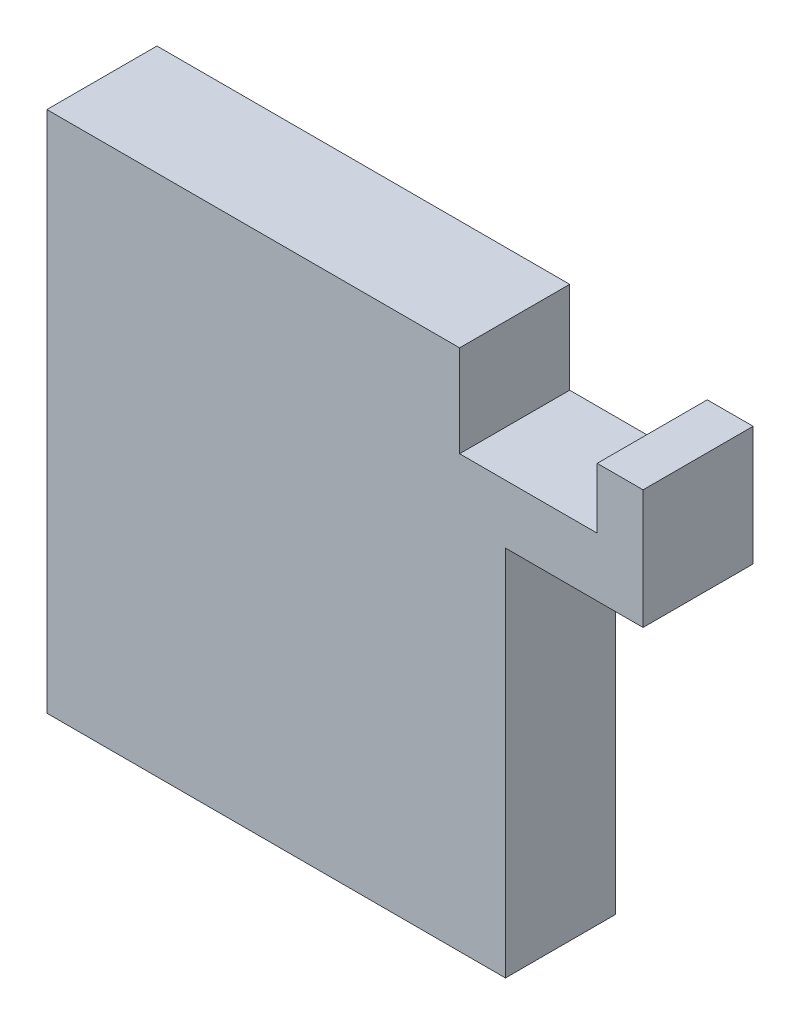
ISO-10303-21;
HEADER;
FILE_DESCRIPTION(('STEP AP214'),'2;1');
FILE_NAME('part.step','',(''),(''),'','','');
FILE_SCHEMA(('AUTOMOTIVE_DESIGN { 1 0 10303 214 1 1 1 1 }'));
ENDSEC;
DATA;
#1=APPLICATION_CONTEXT('core data for automotive mechanical design processes');
#2=APPLICATION_PROTOCOL_DEFINITION('international standard','automotive_design',2000,#1);
#3=PRODUCT_CONTEXT('',#1,'mechanical');
#4=PRODUCT('Part','Part','',(#3));
#5=PRODUCT_RELATED_PRODUCT_CATEGORY('part','',(#4));
#6=PRODUCT_DEFINITION_FORMATION('','',#4);
#7=PRODUCT_DEFINITION_CONTEXT('part definition',#1,'design');
#8=PRODUCT_DEFINITION('design','',#6,#7);
#9=PRODUCT_DEFINITION_SHAPE('','',#8);
#10=(LENGTH_UNIT() NAMED_UNIT(*) SI_UNIT(.MILLI.,.METRE.));
#11=(NAMED_UNIT(*) PLANE_ANGLE_UNIT() SI_UNIT($,.RADIAN.));
#12=(NAMED_UNIT(*) SI_UNIT($,.STERADIAN.) SOLID_ANGLE_UNIT());
#13=UNCERTAINTY_MEASURE_WITH_UNIT(LENGTH_MEASURE(1.E-05),#10,'distance_accuracy_value','');
#14=(GEOMETRIC_REPRESENTATION_CONTEXT(3) GLOBAL_UNCERTAINTY_ASSIGNED_CONTEXT((#13)) GLOBAL_UNIT_ASSIGNED_CONTEXT((#10,
#11,#12)) REPRESENTATION_CONTEXT('',''));
#15=CARTESIAN_POINT('',(0.,0.,0.));
#16=DIRECTION('',(0.,0.,1.));
#17=DIRECTION('',(1.,0.,0.));
#18=AXIS2_PLACEMENT_3D('',#15,#16,#17);
#19=CARTESIAN_POINT('',(4.21925283454536,10.5,1.2));
#20=DIRECTION('',(1.,0.,0.));
#21=DIRECTION('',(0.,1.,0.));
#22=AXIS2_PLACEMENT_3D('',#19,#20,#21);
#23=PLANE('',#22);
#24=DIRECTION('',(0.,-1.,0.));
#25=VECTOR('',#24,1.);
#26=CARTESIAN_POINT('',(4.21925283454536,10.5,0.));
#27=LINE('',#26,#25);
#28=CARTESIAN_POINT('',(4.21925283454536,10.5,0.));
#29=VERTEX_POINT('',#28);
#30=CARTESIAN_POINT('',(4.21925283454536,4.8,0.));
#31=VERTEX_POINT('',#30);
#32=EDGE_CURVE('E140',#29,#31,#27,.T.);
#33=ORIENTED_EDGE('',*,*,#32,.T.);
#34=DIRECTION('',(0.,0.,-1.));
#35=VECTOR('',#34,1.);
#36=CARTESIAN_POINT('',(4.21925283454536,4.8,1.2));
#37=LINE('',#36,#35);
#38=CARTESIAN_POINT('',(4.21925283454536,4.8,1.2));
#39=VERTEX_POINT('',#38);
#40=EDGE_CURVE('E11',#39,#31,#37,.T.);
#41=ORIENTED_EDGE('',*,*,#40,.F.);
#42=DIRECTION('',(0.,-1.,0.));
#43=VECTOR('',#42,1.);
#44=CARTESIAN_POINT('',(4.21925283454536,10.5,1.2));
#45=LINE('',#44,#43);
#46=CARTESIAN_POINT('',(4.21925283454536,10.5,1.2));
#47=VERTEX_POINT('',#46);
#48=EDGE_CURVE('E92',#47,#39,#45,.T.);
#49=ORIENTED_EDGE('',*,*,#48,.F.);
#50=DIRECTION('',(0.,0.,-1.));
#51=VECTOR('',#50,1.);
#52=CARTESIAN_POINT('',(4.21925283454536,10.5,1.2));
#53=LINE('',#52,#51);
#54=EDGE_CURVE('E49',#47,#29,#53,.T.);
#55=ORIENTED_EDGE('',*,*,#54,.T.);
#56=EDGE_LOOP('',(#33,#41,#49,#55));
#57=FACE_BOUND('',#56,.T.);
#58=ADVANCED_FACE('F33',(#57),#23,.F.);
#59=CARTESIAN_POINT('',(9.21925283454536,4.8,1.2));
#60=DIRECTION('',(0.,-1.,0.));
#61=DIRECTION('',(0.,0.,-1.));
#62=AXIS2_PLACEMENT_3D('',#59,#60,#61);
#63=PLANE('',#62);
#64=DIRECTION('',(-1.,0.,0.));
#65=VECTOR('',#64,1.);
#66=CARTESIAN_POINT('',(9.21925283454536,4.8,0.));
#67=LINE('',#66,#65);
#68=CARTESIAN_POINT('',(9.21925283454536,4.8,0.));
#69=VERTEX_POINT('',#68);
#70=EDGE_CURVE('E142',#69,#31,#67,.T.);
#71=ORIENTED_EDGE('',*,*,#70,.F.);
#72=DIRECTION('',(0.,0.,-1.));
#73=VECTOR('',#72,1.);
#74=CARTESIAN_POINT('',(9.21925283454536,4.8,1.2));
#75=LINE('',#74,#73);
#76=CARTESIAN_POINT('',(9.21925283454536,4.8,1.2));
#77=VERTEX_POINT('',#76);
#78=EDGE_CURVE('E41',#77,#69,#75,.T.);
#79=ORIENTED_EDGE('',*,*,#78,.F.);
#80=DIRECTION('',(-1.,0.,0.));
#81=VECTOR('',#80,1.);
#82=CARTESIAN_POINT('',(9.21925283454536,4.8,1.2));
#83=LINE('',#82,#81);
#84=EDGE_CURVE('E197',#77,#39,#83,.T.);
#85=ORIENTED_EDGE('',*,*,#84,.T.);
#86=ORIENTED_EDGE('',*,*,#40,.T.);
#87=EDGE_LOOP('',(#71,#79,#85,#86));
#88=FACE_BOUND('',#87,.T.);
#89=ADVANCED_FACE('F185',(#88),#63,.T.);
#90=CARTESIAN_POINT('',(9.21925283454536,8.8594615548514,1.2));
#91=DIRECTION('',(1.,0.,0.));
#92=DIRECTION('',(0.,1.,0.));
#93=AXIS2_PLACEMENT_3D('',#90,#91,#92);
#94=PLANE('',#93);
#95=DIRECTION('',(0.,-1.,0.));
#96=VECTOR('',#95,1.);
#97=CARTESIAN_POINT('',(9.21925283454536,8.8594615548514,0.));
#98=LINE('',#97,#96);
#99=CARTESIAN_POINT('',(9.21925283454536,8.8594615548514,0.));
#100=VERTEX_POINT('',#99);
#101=EDGE_CURVE('E145',#100,#69,#98,.T.);
#102=ORIENTED_EDGE('',*,*,#101,.F.);
#103=DIRECTION('',(0.,0.,-1.));
#104=VECTOR('',#103,1.);
#105=CARTESIAN_POINT('',(9.21925283454536,8.8594615548514,1.2));
#106=LINE('',#105,#104);
#107=CARTESIAN_POINT('',(9.21925283454536,8.8594615548514,1.2));
#108=VERTEX_POINT('',#107);
#109=EDGE_CURVE('E175',#108,#100,#106,.T.);
#110=ORIENTED_EDGE('',*,*,#109,.F.);
#111=DIRECTION('',(0.,-1.,0.));
#112=VECTOR('',#111,1.);
#113=CARTESIAN_POINT('',(9.21925283454536,8.8594615548514,1.2));
#114=LINE('',#113,#112);
#115=EDGE_CURVE('E182',#108,#77,#114,.T.);
#116=ORIENTED_EDGE('',*,*,#115,.T.);
#117=ORIENTED_EDGE('',*,*,#78,.T.);
#118=EDGE_LOOP('',(#102,#110,#116,#117));
#119=FACE_BOUND('',#118,.T.);
#120=ADVANCED_FACE('F180',(#119),#94,.T.);
#121=CARTESIAN_POINT('',(10.7192528345454,8.8594615548514,1.2));
#122=DIRECTION('',(0.,-1.,0.));
#123=DIRECTION('',(0.,0.,-1.));
#124=AXIS2_PLACEMENT_3D('',#121,#122,#123);
#125=PLANE('',#124);
#126=DIRECTION('',(-1.,0.,0.));
#127=VECTOR('',#126,1.);
#128=CARTESIAN_POINT('',(10.7192528345454,8.8594615548514,0.));
#129=LINE('',#128,#127);
#130=CARTESIAN_POINT('',(10.7192528345454,8.8594615548514,0.));
#131=VERTEX_POINT('',#130);
#132=EDGE_CURVE('E148',#131,#100,#129,.T.);
#133=ORIENTED_EDGE('',*,*,#132,.F.);
#134=DIRECTION('',(0.,0.,-1.));
#135=VECTOR('',#134,1.);
#136=CARTESIAN_POINT('',(10.7192528345454,8.8594615548514,1.2));
#137=LINE('',#136,#135);
#138=CARTESIAN_POINT('',(10.7192528345454,8.8594615548514,1.2));
#139=VERTEX_POINT('',#138);
#140=EDGE_CURVE('E173',#139,#131,#137,.T.);
#141=ORIENTED_EDGE('',*,*,#140,.F.);
#142=DIRECTION('',(-1.,0.,0.));
#143=VECTOR('',#142,1.);
#144=CARTESIAN_POINT('',(10.7192528345454,8.8594615548514,1.2));
#145=LINE('',#144,#143);
#146=EDGE_CURVE('E194',#139,#108,#145,.T.);
#147=ORIENTED_EDGE('',*,*,#146,.T.);
#148=ORIENTED_EDGE('',*,*,#109,.T.);
#149=EDGE_LOOP('',(#133,#141,#147,#148));
#150=FACE_BOUND('',#149,.T.);
#151=ADVANCED_FACE('F191',(#150),#125,.T.);
#152=CARTESIAN_POINT('',(10.7192528345454,10.1594615548514,1.2));
#153=DIRECTION('',(1.,0.,0.));
#154=DIRECTION('',(0.,1.,0.));
#155=AXIS2_PLACEMENT_3D('',#152,#153,#154);
#156=PLANE('',#155);
#157=DIRECTION('',(0.,-1.,0.));
#158=VECTOR('',#157,1.);
#159=CARTESIAN_POINT('',(10.7192528345454,10.1594615548514,0.));
#160=LINE('',#159,#158);
#161=CARTESIAN_POINT('',(10.7192528345454,10.1594615548514,0.));
#162=VERTEX_POINT('',#161);
#163=EDGE_CURVE('E151',#162,#131,#160,.T.);
#164=ORIENTED_EDGE('',*,*,#163,.F.);
#165=DIRECTION('',(0.,0.,-1.));
#166=VECTOR('',#165,1.);
#167=CARTESIAN_POINT('',(10.7192528345454,10.1594615548514,1.2));
#168=LINE('',#167,#166);
#169=CARTESIAN_POINT('',(10.7192528345454,10.1594615548514,1.2));
#170=VERTEX_POINT('',#169);
#171=EDGE_CURVE('E171',#170,#162,#168,.T.);
#172=ORIENTED_EDGE('',*,*,#171,.F.);
#173=DIRECTION('',(0.,-1.,0.));
#174=VECTOR('',#173,1.);
#175=CARTESIAN_POINT('',(10.7192528345454,10.1594615548514,1.2));
#176=LINE('',#175,#174);
#177=EDGE_CURVE('E199',#170,#139,#176,.T.);
#178=ORIENTED_EDGE('',*,*,#177,.T.);
#179=ORIENTED_EDGE('',*,*,#140,.T.);
#180=EDGE_LOOP('',(#164,#172,#178,#179));
#181=FACE_BOUND('',#180,.T.);
#182=ADVANCED_FACE('F232',(#181),#156,.T.);
#183=CARTESIAN_POINT('',(10.2192528345454,10.1594615548514,1.2));
#184=DIRECTION('',(0.,1.,0.));
#185=DIRECTION('',(0.,0.,1.));
#186=AXIS2_PLACEMENT_3D('',#183,#184,#185);
#187=PLANE('',#186);
#188=DIRECTION('',(1.,0.,0.));
#189=VECTOR('',#188,1.);
#190=CARTESIAN_POINT('',(10.2192528345454,10.1594615548514,0.));
#191=LINE('',#190,#189);
#192=CARTESIAN_POINT('',(10.2192528345454,10.1594615548514,0.));
#193=VERTEX_POINT('',#192);
#194=EDGE_CURVE('E154',#193,#162,#191,.T.);
#195=ORIENTED_EDGE('',*,*,#194,.F.);
#196=DIRECTION('',(0.,0.,-1.));
#197=VECTOR('',#196,1.);
#198=CARTESIAN_POINT('',(10.2192528345454,10.1594615548514,1.2));
#199=LINE('',#198,#197);
#200=CARTESIAN_POINT('',(10.2192528345454,10.1594615548514,1.2));
#201=VERTEX_POINT('',#200);
#202=EDGE_CURVE('E169',#201,#193,#199,.T.);
#203=ORIENTED_EDGE('',*,*,#202,.F.);
#204=DIRECTION('',(1.,0.,0.));
#205=VECTOR('',#204,1.);
#206=CARTESIAN_POINT('',(10.2192528345454,10.1594615548514,1.2));
#207=LINE('',#206,#205);
#208=EDGE_CURVE('E205',#201,#170,#207,.T.);
#209=ORIENTED_EDGE('',*,*,#208,.T.);
#210=ORIENTED_EDGE('',*,*,#171,.T.);
#211=EDGE_LOOP('',(#195,#203,#209,#210));
#212=FACE_BOUND('',#211,.T.);
#213=ADVANCED_FACE('F235',(#212),#187,.T.);
#214=CARTESIAN_POINT('',(10.2192528345454,9.50000000000002,1.2));
#215=DIRECTION('',(-1.,0.,0.));
#216=DIRECTION('',(0.,0.,1.));
#217=AXIS2_PLACEMENT_3D('',#214,#215,#216);
#218=PLANE('',#217);
#219=DIRECTION('',(0.,1.,0.));
#220=VECTOR('',#219,1.);
#221=CARTESIAN_POINT('',(10.2192528345454,9.50000000000002,0.));
#222=LINE('',#221,#220);
#223=CARTESIAN_POINT('',(10.2192528345454,9.50000000000002,0.));
#224=VERTEX_POINT('',#223);
#225=EDGE_CURVE('E157',#224,#193,#222,.T.);
#226=ORIENTED_EDGE('',*,*,#225,.F.);
#227=DIRECTION('',(0.,0.,-1.));
#228=VECTOR('',#227,1.);
#229=CARTESIAN_POINT('',(10.2192528345454,9.50000000000002,1.2));
#230=LINE('',#229,#228);
#231=CARTESIAN_POINT('',(10.2192528345454,9.50000000000002,1.2));
#232=VERTEX_POINT('',#231);
#233=EDGE_CURVE('E124',#232,#224,#230,.T.);
#234=ORIENTED_EDGE('',*,*,#233,.F.);
#235=DIRECTION('',(0.,1.,0.));
#236=VECTOR('',#235,1.);
#237=CARTESIAN_POINT('',(10.2192528345454,9.50000000000002,1.2));
#238=LINE('',#237,#236);
#239=EDGE_CURVE('E132',#232,#201,#238,.T.);
#240=ORIENTED_EDGE('',*,*,#239,.T.);
#241=ORIENTED_EDGE('',*,*,#202,.T.);
#242=EDGE_LOOP('',(#226,#234,#240,#241));
#243=FACE_BOUND('',#242,.T.);
#244=ADVANCED_FACE('F209',(#243),#218,.T.);
#245=CARTESIAN_POINT('',(8.71925283454536,9.50000000000002,1.2));
#246=DIRECTION('',(0.,1.,0.));
#247=DIRECTION('',(0.,0.,1.));
#248=AXIS2_PLACEMENT_3D('',#245,#246,#247);
#249=PLANE('',#248);
#250=DIRECTION('',(1.,0.,0.));
#251=VECTOR('',#250,1.);
#252=CARTESIAN_POINT('',(8.71925283454536,9.50000000000002,0.));
#253=LINE('',#252,#251);
#254=CARTESIAN_POINT('',(8.71925283454536,9.50000000000002,0.));
#255=VERTEX_POINT('',#254);
#256=EDGE_CURVE('E120',#255,#224,#253,.T.);
#257=ORIENTED_EDGE('',*,*,#256,.F.);
#258=DIRECTION('',(0.,0.,-1.));
#259=VECTOR('',#258,1.);
#260=CARTESIAN_POINT('',(8.71925283454536,9.50000000000002,1.2));
#261=LINE('',#260,#259);
#262=CARTESIAN_POINT('',(8.71925283454536,9.50000000000002,1.2));
#263=VERTEX_POINT('',#262);
#264=EDGE_CURVE('E115',#263,#255,#261,.T.);
#265=ORIENTED_EDGE('',*,*,#264,.F.);
#266=DIRECTION('',(1.,0.,0.));
#267=VECTOR('',#266,1.);
#268=CARTESIAN_POINT('',(8.71925283454536,9.50000000000002,1.2));
#269=LINE('',#268,#267);
#270=EDGE_CURVE('E118',#263,#232,#269,.T.);
#271=ORIENTED_EDGE('',*,*,#270,.T.);
#272=ORIENTED_EDGE('',*,*,#233,.T.);
#273=EDGE_LOOP('',(#257,#265,#271,#272));
#274=FACE_BOUND('',#273,.T.);
#275=ADVANCED_FACE('F117',(#274),#249,.T.);
#276=CARTESIAN_POINT('',(8.71925283454536,10.5,1.2));
#277=DIRECTION('',(1.,0.,0.));
#278=DIRECTION('',(0.,1.,0.));
#279=AXIS2_PLACEMENT_3D('',#276,#277,#278);
#280=PLANE('',#279);
#281=DIRECTION('',(0.,-1.,0.));
#282=VECTOR('',#281,1.);
#283=CARTESIAN_POINT('',(8.71925283454536,10.5,0.));
#284=LINE('',#283,#282);
#285=CARTESIAN_POINT('',(8.71925283454536,10.5,0.));
#286=VERTEX_POINT('',#285);
#287=EDGE_CURVE('E161',#286,#255,#284,.T.);
#288=ORIENTED_EDGE('',*,*,#287,.F.);
#289=DIRECTION('',(0.,0.,-1.));
#290=VECTOR('',#289,1.);
#291=CARTESIAN_POINT('',(8.71925283454536,10.5,1.2));
#292=LINE('',#291,#290);
#293=CARTESIAN_POINT('',(8.71925283454536,10.5,1.2));
#294=VERTEX_POINT('',#293);
#295=EDGE_CURVE('E80',#294,#286,#292,.T.);
#296=ORIENTED_EDGE('',*,*,#295,.F.);
#297=DIRECTION('',(0.,-1.,0.));
#298=VECTOR('',#297,1.);
#299=CARTESIAN_POINT('',(8.71925283454536,10.5,1.2));
#300=LINE('',#299,#298);
#301=EDGE_CURVE('E129',#294,#263,#300,.T.);
#302=ORIENTED_EDGE('',*,*,#301,.T.);
#303=ORIENTED_EDGE('',*,*,#264,.T.);
#304=EDGE_LOOP('',(#288,#296,#302,#303));
#305=FACE_BOUND('',#304,.T.);
#306=ADVANCED_FACE('F134',(#305),#280,.T.);
#307=CARTESIAN_POINT('',(4.21925283454536,10.5,1.2));
#308=DIRECTION('',(0.,1.,0.));
#309=DIRECTION('',(0.,0.,1.));
#310=AXIS2_PLACEMENT_3D('',#307,#308,#309);
#311=PLANE('',#310);
#312=DIRECTION('',(1.,0.,0.));
#313=VECTOR('',#312,1.);
#314=CARTESIAN_POINT('',(4.21925283454536,10.5,0.));
#315=LINE('',#314,#313);
#316=EDGE_CURVE('E163',#29,#286,#315,.T.);
#317=ORIENTED_EDGE('',*,*,#316,.F.);
#318=ORIENTED_EDGE('',*,*,#54,.F.);
#319=DIRECTION('',(1.,0.,0.));
#320=VECTOR('',#319,1.);
#321=CARTESIAN_POINT('',(4.21925283454536,10.5,1.2));
#322=LINE('',#321,#320);
#323=EDGE_CURVE('E135',#47,#294,#322,.T.);
#324=ORIENTED_EDGE('',*,*,#323,.T.);
#325=ORIENTED_EDGE('',*,*,#295,.T.);
#326=EDGE_LOOP('',(#317,#318,#324,#325));
#327=FACE_BOUND('',#326,.T.);
#328=ADVANCED_FACE('F211',(#327),#311,.T.);
#329=CARTESIAN_POINT('',(0.,0.,1.2));
#330=DIRECTION('',(0.,0.,-1.));
#331=DIRECTION('',(-1.,0.,0.));
#332=AXIS2_PLACEMENT_3D('',#329,#330,#331);
#333=PLANE('',#332);
#334=ORIENTED_EDGE('',*,*,#48,.T.);
#335=ORIENTED_EDGE('',*,*,#84,.F.);
#336=ORIENTED_EDGE('',*,*,#115,.F.);
#337=ORIENTED_EDGE('',*,*,#146,.F.);
#338=ORIENTED_EDGE('',*,*,#177,.F.);
#339=ORIENTED_EDGE('',*,*,#208,.F.);
#340=ORIENTED_EDGE('',*,*,#239,.F.);
#341=ORIENTED_EDGE('',*,*,#270,.F.);
#342=ORIENTED_EDGE('',*,*,#301,.F.);
#343=ORIENTED_EDGE('',*,*,#323,.F.);
#344=EDGE_LOOP('',(#334,#335,#336,#337,#338,#339,#340,#341,#342,#343));
#345=FACE_BOUND('',#344,.T.);
#346=ADVANCED_FACE('F128',(#345),#333,.F.);
#347=CARTESIAN_POINT('',(0.,0.,0.));
#348=DIRECTION('',(0.,0.,-1.));
#349=DIRECTION('',(-1.,0.,0.));
#350=AXIS2_PLACEMENT_3D('',#347,#348,#349);
#351=PLANE('',#350);
#352=ORIENTED_EDGE('',*,*,#32,.F.);
#353=ORIENTED_EDGE('',*,*,#316,.T.);
#354=ORIENTED_EDGE('',*,*,#287,.T.);
#355=ORIENTED_EDGE('',*,*,#256,.T.);
#356=ORIENTED_EDGE('',*,*,#225,.T.);
#357=ORIENTED_EDGE('',*,*,#194,.T.);
#358=ORIENTED_EDGE('',*,*,#163,.T.);
#359=ORIENTED_EDGE('',*,*,#132,.T.);
#360=ORIENTED_EDGE('',*,*,#101,.T.);
#361=ORIENTED_EDGE('',*,*,#70,.T.);
#362=EDGE_LOOP('',(#352,#353,#354,#355,#356,#357,#358,#359,#360,#361));
#363=FACE_BOUND('',#362,.T.);
#364=ADVANCED_FACE('F187',(#363),#351,.T.);
#365=CLOSED_SHELL('',(#58,#89,#120,#151,#182,#213,#244,#275,#306,#328,#346,#364));
#366=MANIFOLD_SOLID_BREP('B2',#365);
#367=ADVANCED_BREP_SHAPE_REPRESENTATION('',(#18,#366),#14);
#368=SHAPE_DEFINITION_REPRESENTATION(#9,#367);
ENDSEC;
END-ISO-10303-21;
